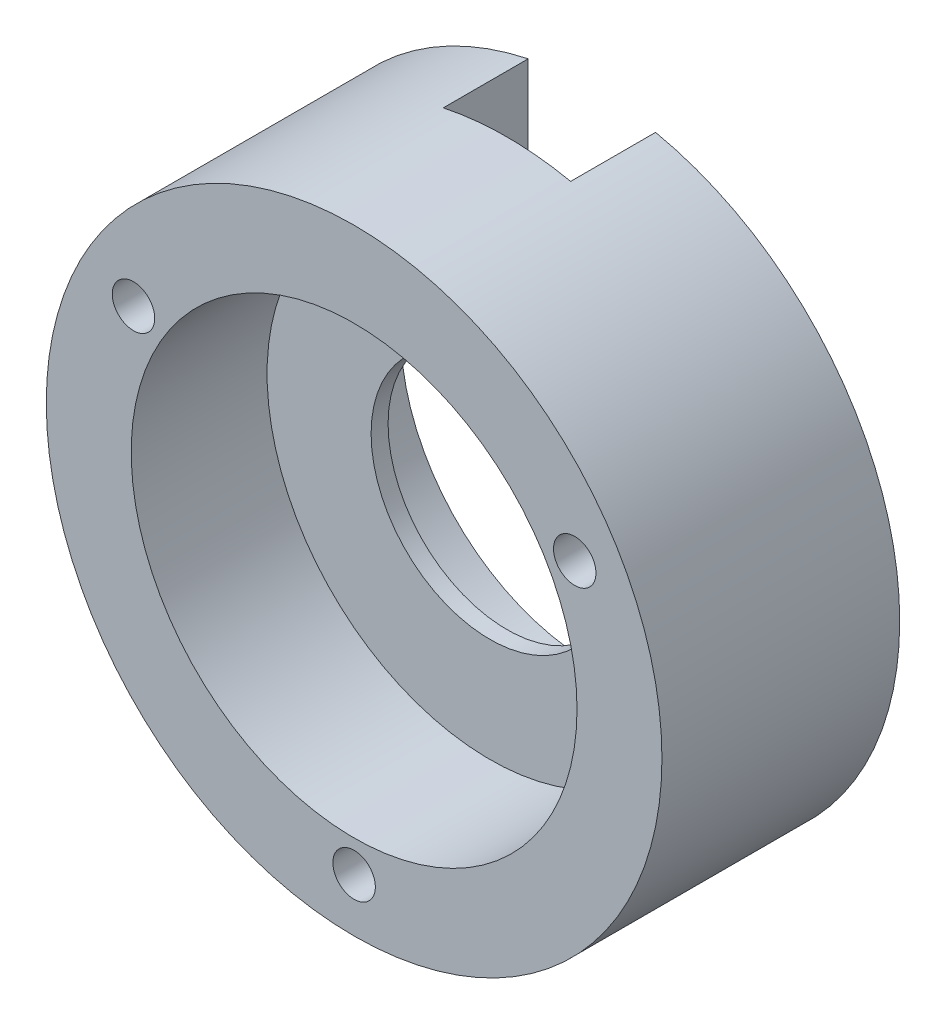
ISO-10303-21;
HEADER;
FILE_DESCRIPTION(('STEP AP214'),'2;1');
FILE_NAME('part.step','',(''),(''),'','','');
FILE_SCHEMA(('AUTOMOTIVE_DESIGN { 1 0 10303 214 1 1 1 1 }'));
ENDSEC;
DATA;
#1=APPLICATION_CONTEXT('core data for automotive mechanical design processes');
#2=APPLICATION_PROTOCOL_DEFINITION('international standard','automotive_design',2000,#1);
#3=PRODUCT_CONTEXT('',#1,'mechanical');
#4=PRODUCT('Part','Part','',(#3));
#5=PRODUCT_RELATED_PRODUCT_CATEGORY('part','',(#4));
#6=PRODUCT_DEFINITION_FORMATION('','',#4);
#7=PRODUCT_DEFINITION_CONTEXT('part definition',#1,'design');
#8=PRODUCT_DEFINITION('design','',#6,#7);
#9=PRODUCT_DEFINITION_SHAPE('','',#8);
#10=(LENGTH_UNIT() NAMED_UNIT(*) SI_UNIT(.MILLI.,.METRE.));
#11=(NAMED_UNIT(*) PLANE_ANGLE_UNIT() SI_UNIT($,.RADIAN.));
#12=(NAMED_UNIT(*) SI_UNIT($,.STERADIAN.) SOLID_ANGLE_UNIT());
#13=UNCERTAINTY_MEASURE_WITH_UNIT(LENGTH_MEASURE(1.E-05),#10,'distance_accuracy_value','');
#14=(GEOMETRIC_REPRESENTATION_CONTEXT(3) GLOBAL_UNCERTAINTY_ASSIGNED_CONTEXT((#13)) GLOBAL_UNIT_ASSIGNED_CONTEXT((#10,
#11,#12)) REPRESENTATION_CONTEXT('',''));
#15=CARTESIAN_POINT('',(0.,0.,0.));
#16=DIRECTION('',(0.,0.,1.));
#17=DIRECTION('',(1.,0.,0.));
#18=AXIS2_PLACEMENT_3D('',#15,#16,#17);
#19=CARTESIAN_POINT('',(0.,0.,16.));
#20=DIRECTION('',(0.,0.,1.));
#21=DIRECTION('',(1.,0.,0.));
#22=AXIS2_PLACEMENT_3D('',#19,#20,#21);
#23=PLANE('',#22);
#24=CARTESIAN_POINT('',(25.9807621135332,14.9999999999999,16.));
#25=DIRECTION('',(0.,0.,-1.));
#26=DIRECTION('',(-1.,0.,0.));
#27=AXIS2_PLACEMENT_3D('',#24,#25,#26);
#28=CIRCLE('',#27,2.50000000000001);
#29=CARTESIAN_POINT('',(23.4807621135332,14.9999999999999,16.));
#30=VERTEX_POINT('',#29);
#31=EDGE_CURVE('E87',#30,#30,#28,.T.);
#32=ORIENTED_EDGE('',*,*,#31,.T.);
#33=EDGE_LOOP('',(#32));
#34=FACE_BOUND('',#33,.T.);
#35=CARTESIAN_POINT('',(-25.9807621135331,15.0000000000022,16.));
#36=DIRECTION('',(0.,0.,-1.));
#37=DIRECTION('',(-1.,0.,0.));
#38=AXIS2_PLACEMENT_3D('',#35,#36,#37);
#39=CIRCLE('',#38,2.50000000000225);
#40=CARTESIAN_POINT('',(-28.4807621135354,15.0000000000022,16.));
#41=VERTEX_POINT('',#40);
#42=EDGE_CURVE('E145',#41,#41,#39,.T.);
#43=ORIENTED_EDGE('',*,*,#42,.T.);
#44=EDGE_LOOP('',(#43));
#45=FACE_BOUND('',#44,.T.);
#46=CARTESIAN_POINT('',(-1.96917333247699E-12,-29.9999999999989,16.));
#47=DIRECTION('',(0.,0.,-1.));
#48=DIRECTION('',(-1.,0.,0.));
#49=AXIS2_PLACEMENT_3D('',#46,#47,#48);
#50=CIRCLE('',#49,2.50000000000086);
#51=CARTESIAN_POINT('',(-2.50000000000283,-29.9999999999989,16.));
#52=VERTEX_POINT('',#51);
#53=EDGE_CURVE('E139',#52,#52,#50,.T.);
#54=ORIENTED_EDGE('',*,*,#53,.T.);
#55=EDGE_LOOP('',(#54));
#56=FACE_BOUND('',#55,.T.);
#57=CARTESIAN_POINT('',(0.,0.,16.));
#58=DIRECTION('',(0.,0.,1.));
#59=DIRECTION('',(1.,0.,0.));
#60=AXIS2_PLACEMENT_3D('',#57,#58,#59);
#61=CIRCLE('',#60,36.25);
#62=CARTESIAN_POINT('',(36.25,0.,16.));
#63=VERTEX_POINT('',#62);
#64=EDGE_CURVE('E46',#63,#63,#61,.T.);
#65=ORIENTED_EDGE('',*,*,#64,.T.);
#66=EDGE_LOOP('',(#65));
#67=FACE_BOUND('',#66,.T.);
#68=CARTESIAN_POINT('',(0.,0.,16.));
#69=DIRECTION('',(0.,0.,1.));
#70=DIRECTION('',(1.,0.,0.));
#71=AXIS2_PLACEMENT_3D('',#68,#69,#70);
#72=CIRCLE('',#71,26.25);
#73=CARTESIAN_POINT('',(26.25,0.,16.));
#74=VERTEX_POINT('',#73);
#75=EDGE_CURVE('E119',#74,#74,#72,.T.);
#76=ORIENTED_EDGE('',*,*,#75,.F.);
#77=EDGE_LOOP('',(#76));
#78=FACE_BOUND('',#77,.T.);
#79=ADVANCED_FACE('F38',(#34,#45,#56,#67,#78),#23,.T.);
#80=CARTESIAN_POINT('',(0.,0.,16.));
#81=DIRECTION('',(0.,0.,-1.));
#82=DIRECTION('',(-1.,0.,0.));
#83=AXIS2_PLACEMENT_3D('',#80,#81,#82);
#84=CYLINDRICAL_SURFACE('',#83,36.25);
#85=ORIENTED_EDGE('',*,*,#64,.F.);
#86=EDGE_LOOP('',(#85));
#87=FACE_BOUND('',#86,.T.);
#88=CARTESIAN_POINT('',(0.,0.,-2.));
#89=DIRECTION('',(0.,0.,1.));
#90=DIRECTION('',(1.,0.,0.));
#91=AXIS2_PLACEMENT_3D('',#88,#89,#90);
#92=CIRCLE('',#91,36.25);
#93=CARTESIAN_POINT('',(7.5,35.4656523977778,-2.));
#94=VERTEX_POINT('',#93);
#95=CARTESIAN_POINT('',(-7.5,35.4656523977778,-2.));
#96=VERTEX_POINT('',#95);
#97=EDGE_CURVE('E61',#94,#96,#92,.T.);
#98=ORIENTED_EDGE('',*,*,#97,.T.);
#99=DIRECTION('',(0.,0.,-1.));
#100=VECTOR('',#99,1.);
#101=CARTESIAN_POINT('',(-7.5,35.4656523977778,16.));
#102=LINE('',#101,#100);
#103=CARTESIAN_POINT('',(-7.5,35.4656523977778,-12.));
#104=VERTEX_POINT('',#103);
#105=EDGE_CURVE('E112',#96,#104,#102,.T.);
#106=ORIENTED_EDGE('',*,*,#105,.T.);
#107=CARTESIAN_POINT('',(0.,0.,-12.));
#108=DIRECTION('',(0.,0.,-1.));
#109=DIRECTION('',(-1.,0.,0.));
#110=AXIS2_PLACEMENT_3D('',#107,#108,#109);
#111=CIRCLE('',#110,36.25);
#112=CARTESIAN_POINT('',(7.5,35.4656523977778,-12.));
#113=VERTEX_POINT('',#112);
#114=EDGE_CURVE('E100',#113,#104,#111,.T.);
#115=ORIENTED_EDGE('',*,*,#114,.F.);
#116=DIRECTION('',(0.,0.,-1.));
#117=VECTOR('',#116,1.);
#118=CARTESIAN_POINT('',(7.5,35.4656523977778,16.));
#119=LINE('',#118,#117);
#120=EDGE_CURVE('E109',#113,#94,#119,.F.);
#121=ORIENTED_EDGE('',*,*,#120,.T.);
#122=EDGE_LOOP('',(#98,#106,#115,#121));
#123=FACE_BOUND('',#122,.T.);
#124=ADVANCED_FACE('F40',(#87,#123),#84,.T.);
#125=CARTESIAN_POINT('',(0.,0.,16.));
#126=DIRECTION('',(0.,0.,-1.));
#127=DIRECTION('',(-1.,0.,0.));
#128=AXIS2_PLACEMENT_3D('',#125,#126,#127);
#129=CYLINDRICAL_SURFACE('',#128,26.25);
#130=ORIENTED_EDGE('',*,*,#75,.T.);
#131=EDGE_LOOP('',(#130));
#132=FACE_BOUND('',#131,.T.);
#133=CARTESIAN_POINT('',(0.,0.,0.));
#134=DIRECTION('',(0.,0.,1.));
#135=DIRECTION('',(1.,0.,0.));
#136=AXIS2_PLACEMENT_3D('',#133,#134,#135);
#137=CIRCLE('',#136,26.25);
#138=CARTESIAN_POINT('',(26.25,0.,0.));
#139=VERTEX_POINT('',#138);
#140=EDGE_CURVE('E118',#139,#139,#137,.T.);
#141=ORIENTED_EDGE('',*,*,#140,.F.);
#142=EDGE_LOOP('',(#141));
#143=FACE_BOUND('',#142,.T.);
#144=ADVANCED_FACE('F130',(#132,#143),#129,.F.);
#145=CARTESIAN_POINT('',(0.,0.,0.));
#146=DIRECTION('',(0.,0.,-1.));
#147=DIRECTION('',(-1.,0.,0.));
#148=AXIS2_PLACEMENT_3D('',#145,#146,#147);
#149=PLANE('',#148);
#150=CARTESIAN_POINT('',(0.,0.,0.));
#151=DIRECTION('',(0.,0.,-1.));
#152=DIRECTION('',(-1.,0.,0.));
#153=AXIS2_PLACEMENT_3D('',#150,#151,#152);
#154=CIRCLE('',#153,14.);
#155=CARTESIAN_POINT('',(-14.,0.,0.));
#156=VERTEX_POINT('',#155);
#157=EDGE_CURVE('E114',#156,#156,#154,.T.);
#158=ORIENTED_EDGE('',*,*,#157,.T.);
#159=EDGE_LOOP('',(#158));
#160=FACE_BOUND('',#159,.T.);
#161=ORIENTED_EDGE('',*,*,#140,.T.);
#162=EDGE_LOOP('',(#161));
#163=FACE_BOUND('',#162,.T.);
#164=ADVANCED_FACE('F166',(#160,#163),#149,.F.);
#165=CARTESIAN_POINT('',(0.,0.,-12.));
#166=DIRECTION('',(0.,0.,-1.));
#167=DIRECTION('',(-1.,0.,0.));
#168=AXIS2_PLACEMENT_3D('',#165,#166,#167);
#169=PLANE('',#168);
#170=CARTESIAN_POINT('',(25.9807621135332,14.9999999999999,-12.));
#171=DIRECTION('',(0.,0.,-1.));
#172=DIRECTION('',(-1.,0.,0.));
#173=AXIS2_PLACEMENT_3D('',#170,#171,#172);
#174=CIRCLE('',#173,2.50000000000001);
#175=CARTESIAN_POINT('',(23.4807621135332,14.9999999999999,-12.));
#176=VERTEX_POINT('',#175);
#177=EDGE_CURVE('E148',#176,#176,#174,.T.);
#178=ORIENTED_EDGE('',*,*,#177,.F.);
#179=EDGE_LOOP('',(#178));
#180=FACE_BOUND('',#179,.T.);
#181=CARTESIAN_POINT('',(-25.9807621135331,15.0000000000022,-12.));
#182=DIRECTION('',(0.,0.,-1.));
#183=DIRECTION('',(-1.,0.,0.));
#184=AXIS2_PLACEMENT_3D('',#181,#182,#183);
#185=CIRCLE('',#184,2.50000000000225);
#186=CARTESIAN_POINT('',(-28.4807621135354,15.0000000000022,-12.));
#187=VERTEX_POINT('',#186);
#188=EDGE_CURVE('E142',#187,#187,#185,.T.);
#189=ORIENTED_EDGE('',*,*,#188,.F.);
#190=EDGE_LOOP('',(#189));
#191=FACE_BOUND('',#190,.T.);
#192=CARTESIAN_POINT('',(-1.96917333247699E-12,-29.9999999999989,-12.));
#193=DIRECTION('',(0.,0.,-1.));
#194=DIRECTION('',(-1.,0.,0.));
#195=AXIS2_PLACEMENT_3D('',#192,#193,#194);
#196=CIRCLE('',#195,2.50000000000086);
#197=CARTESIAN_POINT('',(-2.50000000000283,-29.9999999999989,-12.));
#198=VERTEX_POINT('',#197);
#199=EDGE_CURVE('E136',#198,#198,#196,.T.);
#200=ORIENTED_EDGE('',*,*,#199,.F.);
#201=EDGE_LOOP('',(#200));
#202=FACE_BOUND('',#201,.T.);
#203=CARTESIAN_POINT('',(0.,0.,-12.));
#204=DIRECTION('',(0.,0.,-1.));
#205=DIRECTION('',(-1.,0.,0.));
#206=AXIS2_PLACEMENT_3D('',#203,#204,#205);
#207=CIRCLE('',#206,22.5);
#208=CARTESIAN_POINT('',(7.5,21.2132034355964,-12.));
#209=VERTEX_POINT('',#208);
#210=CARTESIAN_POINT('',(-7.5,21.2132034355964,-12.));
#211=VERTEX_POINT('',#210);
#212=EDGE_CURVE('E78',#209,#211,#207,.T.);
#213=ORIENTED_EDGE('',*,*,#212,.F.);
#214=DIRECTION('',(0.,-1.,0.));
#215=VECTOR('',#214,1.);
#216=CARTESIAN_POINT('',(7.5,38.,-12.));
#217=LINE('',#216,#215);
#218=EDGE_CURVE('E101',#113,#209,#217,.T.);
#219=ORIENTED_EDGE('',*,*,#218,.F.);
#220=ORIENTED_EDGE('',*,*,#114,.T.);
#221=DIRECTION('',(0.,1.,0.));
#222=VECTOR('',#221,1.);
#223=CARTESIAN_POINT('',(-7.5,38.,-12.));
#224=LINE('',#223,#222);
#225=EDGE_CURVE('E93',#211,#104,#224,.T.);
#226=ORIENTED_EDGE('',*,*,#225,.F.);
#227=EDGE_LOOP('',(#213,#219,#220,#226));
#228=FACE_BOUND('',#227,.T.);
#229=ADVANCED_FACE('F98',(#180,#191,#202,#228),#169,.T.);
#230=CARTESIAN_POINT('',(0.,0.,-12.));
#231=DIRECTION('',(0.,0.,1.));
#232=DIRECTION('',(1.,0.,0.));
#233=AXIS2_PLACEMENT_3D('',#230,#231,#232);
#234=CYLINDRICAL_SURFACE('',#233,14.);
#235=CARTESIAN_POINT('',(0.,0.,-2.));
#236=DIRECTION('',(0.,0.,1.));
#237=DIRECTION('',(1.,0.,0.));
#238=AXIS2_PLACEMENT_3D('',#235,#236,#237);
#239=CIRCLE('',#238,14.);
#240=CARTESIAN_POINT('',(14.,0.,-2.));
#241=VERTEX_POINT('',#240);
#242=EDGE_CURVE('E11',#241,#241,#239,.T.);
#243=ORIENTED_EDGE('',*,*,#242,.F.);
#244=EDGE_LOOP('',(#243));
#245=FACE_BOUND('',#244,.T.);
#246=ORIENTED_EDGE('',*,*,#157,.F.);
#247=EDGE_LOOP('',(#246));
#248=FACE_BOUND('',#247,.T.);
#249=ADVANCED_FACE('F165',(#245,#248),#234,.F.);
#250=CARTESIAN_POINT('',(-7.5,38.,-2.));
#251=DIRECTION('',(-1.,0.,0.));
#252=DIRECTION('',(0.,-1.,0.));
#253=AXIS2_PLACEMENT_3D('',#250,#251,#252);
#254=PLANE('',#253);
#255=DIRECTION('',(0.,1.,0.));
#256=VECTOR('',#255,1.);
#257=CARTESIAN_POINT('',(-7.5,38.,-2.));
#258=LINE('',#257,#256);
#259=CARTESIAN_POINT('',(-7.5,21.2132034355964,-2.));
#260=VERTEX_POINT('',#259);
#261=EDGE_CURVE('E95',#260,#96,#258,.T.);
#262=ORIENTED_EDGE('',*,*,#261,.F.);
#263=DIRECTION('',(0.,0.,-1.));
#264=VECTOR('',#263,1.);
#265=CARTESIAN_POINT('',(-7.5,21.2132034355964,61.6396103067893));
#266=LINE('',#265,#264);
#267=EDGE_CURVE('E81',#260,#211,#266,.T.);
#268=ORIENTED_EDGE('',*,*,#267,.T.);
#269=ORIENTED_EDGE('',*,*,#225,.T.);
#270=ORIENTED_EDGE('',*,*,#105,.F.);
#271=EDGE_LOOP('',(#262,#268,#269,#270));
#272=FACE_BOUND('',#271,.T.);
#273=ADVANCED_FACE('F91',(#272),#254,.F.);
#274=CARTESIAN_POINT('',(7.5,38.,-2.));
#275=DIRECTION('',(1.,0.,0.));
#276=DIRECTION('',(0.,0.,-1.));
#277=AXIS2_PLACEMENT_3D('',#274,#275,#276);
#278=PLANE('',#277);
#279=ORIENTED_EDGE('',*,*,#218,.T.);
#280=DIRECTION('',(0.,0.,-1.));
#281=VECTOR('',#280,1.);
#282=CARTESIAN_POINT('',(7.5,21.2132034355964,61.6396103067893));
#283=LINE('',#282,#281);
#284=CARTESIAN_POINT('',(7.5,21.2132034355964,-2.));
#285=VERTEX_POINT('',#284);
#286=EDGE_CURVE('E82',#209,#285,#283,.F.);
#287=ORIENTED_EDGE('',*,*,#286,.T.);
#288=DIRECTION('',(0.,-1.,0.));
#289=VECTOR('',#288,1.);
#290=CARTESIAN_POINT('',(7.5,38.,-2.));
#291=LINE('',#290,#289);
#292=EDGE_CURVE('E105',#94,#285,#291,.T.);
#293=ORIENTED_EDGE('',*,*,#292,.F.);
#294=ORIENTED_EDGE('',*,*,#120,.F.);
#295=EDGE_LOOP('',(#279,#287,#293,#294));
#296=FACE_BOUND('',#295,.T.);
#297=ADVANCED_FACE('F132',(#296),#278,.F.);
#298=CARTESIAN_POINT('',(0.,0.,-2.));
#299=DIRECTION('',(0.,0.,1.));
#300=DIRECTION('',(1.,0.,0.));
#301=AXIS2_PLACEMENT_3D('',#298,#299,#300);
#302=PLANE('',#301);
#303=CARTESIAN_POINT('',(0.,0.,-2.));
#304=DIRECTION('',(0.,0.,1.));
#305=DIRECTION('',(1.,0.,0.));
#306=AXIS2_PLACEMENT_3D('',#303,#304,#305);
#307=CIRCLE('',#306,22.5);
#308=EDGE_CURVE('E53',#285,#260,#307,.F.);
#309=ORIENTED_EDGE('',*,*,#308,.T.);
#310=ORIENTED_EDGE('',*,*,#261,.T.);
#311=ORIENTED_EDGE('',*,*,#97,.F.);
#312=ORIENTED_EDGE('',*,*,#292,.T.);
#313=EDGE_LOOP('',(#309,#310,#311,#312));
#314=FACE_BOUND('',#313,.T.);
#315=ORIENTED_EDGE('',*,*,#242,.T.);
#316=EDGE_LOOP('',(#315));
#317=FACE_BOUND('',#316,.T.);
#318=ADVANCED_FACE('F182',(#314,#317),#302,.F.);
#319=CARTESIAN_POINT('',(0.,0.,61.6396103067893));
#320=DIRECTION('',(0.,0.,-1.));
#321=DIRECTION('',(-1.,0.,0.));
#322=AXIS2_PLACEMENT_3D('',#319,#320,#321);
#323=CYLINDRICAL_SURFACE('',#322,22.5);
#324=ORIENTED_EDGE('',*,*,#308,.F.);
#325=ORIENTED_EDGE('',*,*,#286,.F.);
#326=ORIENTED_EDGE('',*,*,#212,.T.);
#327=ORIENTED_EDGE('',*,*,#267,.F.);
#328=EDGE_LOOP('',(#324,#325,#326,#327));
#329=FACE_BOUND('',#328,.T.);
#330=ADVANCED_FACE('F80',(#329),#323,.F.);
#331=CARTESIAN_POINT('',(-1.96917333247699E-12,-29.9999999999989,16.));
#332=DIRECTION('',(0.,0.,-1.));
#333=DIRECTION('',(-1.,0.,0.));
#334=AXIS2_PLACEMENT_3D('',#331,#332,#333);
#335=CYLINDRICAL_SURFACE('',#334,2.50000000000086);
#336=ORIENTED_EDGE('',*,*,#53,.F.);
#337=EDGE_LOOP('',(#336));
#338=FACE_BOUND('',#337,.T.);
#339=ORIENTED_EDGE('',*,*,#199,.T.);
#340=EDGE_LOOP('',(#339));
#341=FACE_BOUND('',#340,.T.);
#342=ADVANCED_FACE('F172',(#338,#341),#335,.F.);
#343=CARTESIAN_POINT('',(-25.9807621135331,15.0000000000022,16.));
#344=DIRECTION('',(0.,0.,-1.));
#345=DIRECTION('',(-1.,0.,0.));
#346=AXIS2_PLACEMENT_3D('',#343,#344,#345);
#347=CYLINDRICAL_SURFACE('',#346,2.50000000000225);
#348=ORIENTED_EDGE('',*,*,#42,.F.);
#349=EDGE_LOOP('',(#348));
#350=FACE_BOUND('',#349,.T.);
#351=ORIENTED_EDGE('',*,*,#188,.T.);
#352=EDGE_LOOP('',(#351));
#353=FACE_BOUND('',#352,.T.);
#354=ADVANCED_FACE('F159',(#350,#353),#347,.F.);
#355=CARTESIAN_POINT('',(25.9807621135332,14.9999999999999,16.));
#356=DIRECTION('',(0.,0.,-1.));
#357=DIRECTION('',(-1.,0.,0.));
#358=AXIS2_PLACEMENT_3D('',#355,#356,#357);
#359=CYLINDRICAL_SURFACE('',#358,2.50000000000001);
#360=ORIENTED_EDGE('',*,*,#31,.F.);
#361=EDGE_LOOP('',(#360));
#362=FACE_BOUND('',#361,.T.);
#363=ORIENTED_EDGE('',*,*,#177,.T.);
#364=EDGE_LOOP('',(#363));
#365=FACE_BOUND('',#364,.T.);
#366=ADVANCED_FACE('F156',(#362,#365),#359,.F.);
#367=CLOSED_SHELL('',(#79,#124,#144,#164,#229,#249,#273,#297,#318,#330,#342,#354,#366));
#368=MANIFOLD_SOLID_BREP('B2',#367);
#369=ADVANCED_BREP_SHAPE_REPRESENTATION('',(#18,#368),#14);
#370=SHAPE_DEFINITION_REPRESENTATION(#9,#369);
ENDSEC;
END-ISO-10303-21;
